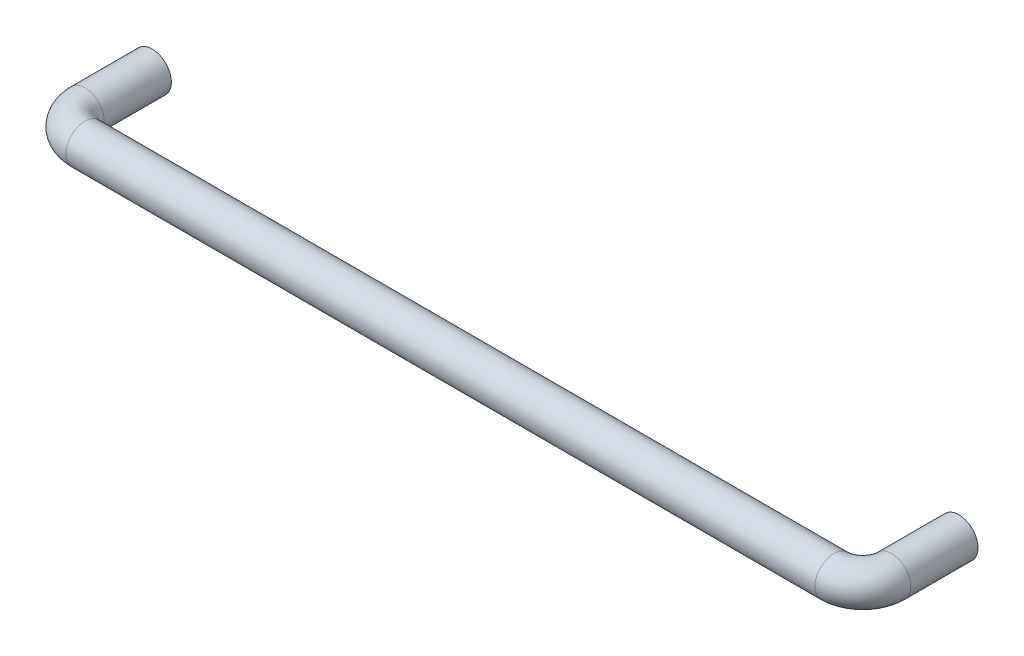
ISO-10303-21;
HEADER;
FILE_DESCRIPTION(('STEP AP214'),'2;1');
FILE_NAME('part.step','',(''),(''),'','','');
FILE_SCHEMA(('AUTOMOTIVE_DESIGN { 1 0 10303 214 1 1 1 1 }'));
ENDSEC;
DATA;
#1=APPLICATION_CONTEXT('core data for automotive mechanical design processes');
#2=APPLICATION_PROTOCOL_DEFINITION('international standard','automotive_design',2000,#1);
#3=PRODUCT_CONTEXT('',#1,'mechanical');
#4=PRODUCT('Part','Part','',(#3));
#5=PRODUCT_RELATED_PRODUCT_CATEGORY('part','',(#4));
#6=PRODUCT_DEFINITION_FORMATION('','',#4);
#7=PRODUCT_DEFINITION_CONTEXT('part definition',#1,'design');
#8=PRODUCT_DEFINITION('design','',#6,#7);
#9=PRODUCT_DEFINITION_SHAPE('','',#8);
#10=(LENGTH_UNIT() NAMED_UNIT(*) SI_UNIT(.MILLI.,.METRE.));
#11=(NAMED_UNIT(*) PLANE_ANGLE_UNIT() SI_UNIT($,.RADIAN.));
#12=(NAMED_UNIT(*) SI_UNIT($,.STERADIAN.) SOLID_ANGLE_UNIT());
#13=UNCERTAINTY_MEASURE_WITH_UNIT(LENGTH_MEASURE(1.E-05),#10,'distance_accuracy_value','');
#14=(GEOMETRIC_REPRESENTATION_CONTEXT(3) GLOBAL_UNCERTAINTY_ASSIGNED_CONTEXT((#13)) GLOBAL_UNIT_ASSIGNED_CONTEXT((#10,
#11,#12)) REPRESENTATION_CONTEXT('',''));
#15=CARTESIAN_POINT('',(0.,0.,0.));
#16=DIRECTION('',(0.,0.,1.));
#17=DIRECTION('',(1.,0.,0.));
#18=AXIS2_PLACEMENT_3D('',#15,#16,#17);
#19=CARTESIAN_POINT('',(0.,0.,0.));
#20=DIRECTION('',(0.,0.,1.));
#21=DIRECTION('',(1.,0.,0.));
#22=AXIS2_PLACEMENT_3D('',#19,#20,#21);
#23=PLANE('',#22);
#24=CARTESIAN_POINT('',(0.,0.,0.));
#25=DIRECTION('',(0.,0.,1.));
#26=DIRECTION('',(1.,0.,0.));
#27=AXIS2_PLACEMENT_3D('',#24,#25,#26);
#28=CIRCLE('',#27,1.);
#29=CARTESIAN_POINT('',(1.,0.,0.));
#30=VERTEX_POINT('',#29);
#31=EDGE_CURVE('E52',#30,#30,#28,.T.);
#32=ORIENTED_EDGE('',*,*,#31,.F.);
#33=EDGE_LOOP('',(#32));
#34=FACE_BOUND('',#33,.T.);
#35=ADVANCED_FACE('F39',(#34),#23,.F.);
#36=CARTESIAN_POINT('',(-42.,0.,0.));
#37=DIRECTION('',(0.,0.,-1.));
#38=DIRECTION('',(-1.,0.,0.));
#39=AXIS2_PLACEMENT_3D('',#36,#37,#38);
#40=PLANE('',#39);
#41=CARTESIAN_POINT('',(-42.,0.,0.));
#42=DIRECTION('',(0.,0.,-1.));
#43=DIRECTION('',(-1.,0.,0.));
#44=AXIS2_PLACEMENT_3D('',#41,#42,#43);
#45=CIRCLE('',#44,1.);
#46=CARTESIAN_POINT('',(-43.,0.,0.));
#47=VERTEX_POINT('',#46);
#48=EDGE_CURVE('E11',#47,#47,#45,.T.);
#49=ORIENTED_EDGE('',*,*,#48,.T.);
#50=EDGE_LOOP('',(#49));
#51=FACE_BOUND('',#50,.T.);
#52=ADVANCED_FACE('F55',(#51),#40,.T.);
#53=CARTESIAN_POINT('',(0.,0.,0.));
#54=DIRECTION('',(0.,0.,1.));
#55=DIRECTION('',(1.,0.,0.));
#56=AXIS2_PLACEMENT_3D('',#53,#54,#55);
#57=CYLINDRICAL_SURFACE('',#56,1.);
#58=CARTESIAN_POINT('',(0.,0.,3.5));
#59=DIRECTION('',(0.,0.,1.));
#60=DIRECTION('',(1.,0.,0.));
#61=AXIS2_PLACEMENT_3D('',#58,#59,#60);
#62=CIRCLE('',#61,1.);
#63=CARTESIAN_POINT('',(0.999999999999999,0.,3.5));
#64=VERTEX_POINT('',#63);
#65=EDGE_CURVE('E75',#64,#64,#62,.T.);
#66=ORIENTED_EDGE('',*,*,#65,.F.);
#67=EDGE_LOOP('',(#66));
#68=FACE_BOUND('',#67,.T.);
#69=ORIENTED_EDGE('',*,*,#31,.T.);
#70=EDGE_LOOP('',(#69));
#71=FACE_BOUND('',#70,.T.);
#72=ADVANCED_FACE('F81',(#68,#71),#57,.T.);
#73=CARTESIAN_POINT('',(-1.5,0.,3.5));
#74=DIRECTION('',(0.,-1.,0.));
#75=DIRECTION('',(0.,0.,-1.));
#76=AXIS2_PLACEMENT_3D('',#73,#74,#75);
#77=TOROIDAL_SURFACE('',#76,1.5,1.);
#78=CARTESIAN_POINT('',(-1.5,0.,5.));
#79=DIRECTION('',(-1.,0.,0.));
#80=DIRECTION('',(0.,0.,1.));
#81=AXIS2_PLACEMENT_3D('',#78,#79,#80);
#82=CIRCLE('',#81,1.);
#83=CARTESIAN_POINT('',(-1.5,0.,6.));
#84=VERTEX_POINT('',#83);
#85=EDGE_CURVE('E69',#84,#84,#82,.T.);
#86=CARTESIAN_POINT('',(-1.5,0.,3.5));
#87=DIRECTION('',(0.,-1.,0.));
#88=DIRECTION('',(0.,0.,-1.));
#89=AXIS2_PLACEMENT_3D('',#86,#87,#88);
#90=CIRCLE('',#89,2.5);
#91=EDGE_CURVE('',#64,#84,#90,.T.);
#92=ORIENTED_EDGE('',*,*,#65,.T.);
#93=ORIENTED_EDGE('',*,*,#85,.F.);
#94=ORIENTED_EDGE('',*,*,#91,.T.);
#95=ORIENTED_EDGE('',*,*,#91,.F.);
#96=EDGE_LOOP('',(#92,#94,#93,#95));
#97=FACE_BOUND('',#96,.T.);
#98=ADVANCED_FACE('F83',(#97),#77,.T.);
#99=CARTESIAN_POINT('',(-1.5,0.,5.));
#100=DIRECTION('',(-1.,0.,0.));
#101=DIRECTION('',(0.,0.,1.));
#102=AXIS2_PLACEMENT_3D('',#99,#100,#101);
#103=CYLINDRICAL_SURFACE('',#102,1.);
#104=CARTESIAN_POINT('',(-40.5,0.,5.));
#105=DIRECTION('',(-1.,0.,0.));
#106=DIRECTION('',(0.,0.,1.));
#107=AXIS2_PLACEMENT_3D('',#104,#105,#106);
#108=CIRCLE('',#107,1.);
#109=CARTESIAN_POINT('',(-40.5,0.,5.99999999999999));
#110=VERTEX_POINT('',#109);
#111=EDGE_CURVE('E66',#110,#110,#108,.T.);
#112=ORIENTED_EDGE('',*,*,#111,.F.);
#113=EDGE_LOOP('',(#112));
#114=FACE_BOUND('',#113,.T.);
#115=ORIENTED_EDGE('',*,*,#85,.T.);
#116=EDGE_LOOP('',(#115));
#117=FACE_BOUND('',#116,.T.);
#118=ADVANCED_FACE('F90',(#114,#117),#103,.T.);
#119=CARTESIAN_POINT('',(-40.5,0.,3.5));
#120=DIRECTION('',(0.,-1.,0.));
#121=DIRECTION('',(0.,0.,-1.));
#122=AXIS2_PLACEMENT_3D('',#119,#120,#121);
#123=TOROIDAL_SURFACE('',#122,1.49999999999999,1.);
#124=CARTESIAN_POINT('',(-42.,0.,3.5));
#125=DIRECTION('',(0.,0.,-1.));
#126=DIRECTION('',(-1.,0.,0.));
#127=AXIS2_PLACEMENT_3D('',#124,#125,#126);
#128=CIRCLE('',#127,1.);
#129=CARTESIAN_POINT('',(-43.,0.,3.5));
#130=VERTEX_POINT('',#129);
#131=EDGE_CURVE('E47',#130,#130,#128,.T.);
#132=CARTESIAN_POINT('',(-40.5,0.,3.5));
#133=DIRECTION('',(0.,-1.,0.));
#134=DIRECTION('',(0.,0.,-1.));
#135=AXIS2_PLACEMENT_3D('',#132,#133,#134);
#136=CIRCLE('',#135,2.49999999999999);
#137=EDGE_CURVE('',#110,#130,#136,.T.);
#138=ORIENTED_EDGE('',*,*,#111,.T.);
#139=ORIENTED_EDGE('',*,*,#131,.F.);
#140=ORIENTED_EDGE('',*,*,#137,.T.);
#141=ORIENTED_EDGE('',*,*,#137,.F.);
#142=EDGE_LOOP('',(#138,#140,#139,#141));
#143=FACE_BOUND('',#142,.T.);
#144=ADVANCED_FACE('F60',(#143),#123,.T.);
#145=CARTESIAN_POINT('',(-42.,0.,3.5));
#146=DIRECTION('',(0.,0.,-1.));
#147=DIRECTION('',(-1.,0.,0.));
#148=AXIS2_PLACEMENT_3D('',#145,#146,#147);
#149=CYLINDRICAL_SURFACE('',#148,1.);
#150=ORIENTED_EDGE('',*,*,#48,.F.);
#151=EDGE_LOOP('',(#150));
#152=FACE_BOUND('',#151,.T.);
#153=ORIENTED_EDGE('',*,*,#131,.T.);
#154=EDGE_LOOP('',(#153));
#155=FACE_BOUND('',#154,.T.);
#156=ADVANCED_FACE('F57',(#152,#155),#149,.T.);
#157=CLOSED_SHELL('',(#35,#52,#72,#98,#118,#144,#156));
#158=MANIFOLD_SOLID_BREP('B2',#157);
#159=ADVANCED_BREP_SHAPE_REPRESENTATION('',(#18,#158),#14);
#160=SHAPE_DEFINITION_REPRESENTATION(#9,#159);
ENDSEC;
END-ISO-10303-21;
